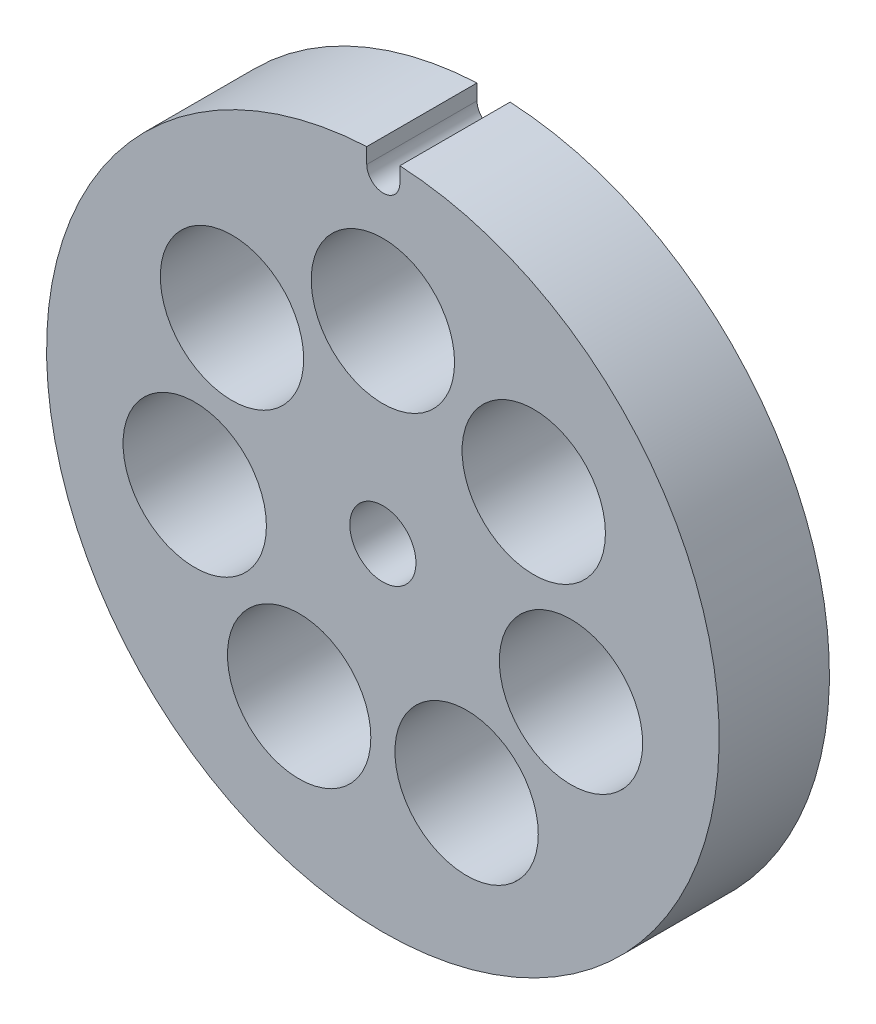
ISO-10303-21;
HEADER;
FILE_DESCRIPTION(('STEP AP214'),'2;1');
FILE_NAME('part.step','',(''),(''),'','','');
FILE_SCHEMA(('AUTOMOTIVE_DESIGN { 1 0 10303 214 1 1 1 1 }'));
ENDSEC;
DATA;
#1=APPLICATION_CONTEXT('core data for automotive mechanical design processes');
#2=APPLICATION_PROTOCOL_DEFINITION('international standard','automotive_design',2000,#1);
#3=PRODUCT_CONTEXT('',#1,'mechanical');
#4=PRODUCT('Part','Part','',(#3));
#5=PRODUCT_RELATED_PRODUCT_CATEGORY('part','',(#4));
#6=PRODUCT_DEFINITION_FORMATION('','',#4);
#7=PRODUCT_DEFINITION_CONTEXT('part definition',#1,'design');
#8=PRODUCT_DEFINITION('design','',#6,#7);
#9=PRODUCT_DEFINITION_SHAPE('','',#8);
#10=(LENGTH_UNIT() NAMED_UNIT(*) SI_UNIT(.MILLI.,.METRE.));
#11=(NAMED_UNIT(*) PLANE_ANGLE_UNIT() SI_UNIT($,.RADIAN.));
#12=(NAMED_UNIT(*) SI_UNIT($,.STERADIAN.) SOLID_ANGLE_UNIT());
#13=UNCERTAINTY_MEASURE_WITH_UNIT(LENGTH_MEASURE(1.E-05),#10,'distance_accuracy_value','');
#14=(GEOMETRIC_REPRESENTATION_CONTEXT(3) GLOBAL_UNCERTAINTY_ASSIGNED_CONTEXT((#13)) GLOBAL_UNIT_ASSIGNED_CONTEXT((#10,
#11,#12)) REPRESENTATION_CONTEXT('',''));
#15=CARTESIAN_POINT('',(0.,0.,0.));
#16=DIRECTION('',(0.,0.,1.));
#17=DIRECTION('',(1.,0.,0.));
#18=AXIS2_PLACEMENT_3D('',#15,#16,#17);
#19=CARTESIAN_POINT('',(0.0364619666380359,29.0612751641338,10.));
#20=DIRECTION('',(0.,0.,-1.));
#21=DIRECTION('',(-1.,0.,0.));
#22=AXIS2_PLACEMENT_3D('',#19,#20,#21);
#23=CYLINDRICAL_SURFACE('',#22,1.5);
#24=CARTESIAN_POINT('',(0.0364619666380359,29.0612751641338,0.));
#25=DIRECTION('',(0.,0.,1.));
#26=DIRECTION('',(1.,0.,0.));
#27=AXIS2_PLACEMENT_3D('',#24,#25,#26);
#28=CIRCLE('',#27,1.5);
#29=CARTESIAN_POINT('',(-1.46353803336196,29.0612751641338,0.));
#30=VERTEX_POINT('',#29);
#31=CARTESIAN_POINT('',(1.53646196663804,29.0612751641338,0.));
#32=VERTEX_POINT('',#31);
#33=EDGE_CURVE('E121',#30,#32,#28,.T.);
#34=ORIENTED_EDGE('',*,*,#33,.F.);
#35=DIRECTION('',(0.,0.,-1.));
#36=VECTOR('',#35,1.);
#37=CARTESIAN_POINT('',(-1.46353803336196,29.0612751641338,10.));
#38=LINE('',#37,#36);
#39=CARTESIAN_POINT('',(-1.46353803336196,29.0612751641338,10.));
#40=VERTEX_POINT('',#39);
#41=EDGE_CURVE('E11',#40,#30,#38,.T.);
#42=ORIENTED_EDGE('',*,*,#41,.F.);
#43=CARTESIAN_POINT('',(0.0364619666380359,29.0612751641338,10.));
#44=DIRECTION('',(0.,0.,1.));
#45=DIRECTION('',(1.,0.,0.));
#46=AXIS2_PLACEMENT_3D('',#43,#44,#45);
#47=CIRCLE('',#46,1.5);
#48=CARTESIAN_POINT('',(1.53646196663804,29.0612751641338,10.));
#49=VERTEX_POINT('',#48);
#50=EDGE_CURVE('E82',#40,#49,#47,.T.);
#51=ORIENTED_EDGE('',*,*,#50,.T.);
#52=DIRECTION('',(0.,0.,-1.));
#53=VECTOR('',#52,1.);
#54=CARTESIAN_POINT('',(1.53646196663804,29.0612751641338,10.));
#55=LINE('',#54,#53);
#56=EDGE_CURVE('E49',#49,#32,#55,.T.);
#57=ORIENTED_EDGE('',*,*,#56,.T.);
#58=EDGE_LOOP('',(#34,#42,#51,#57));
#59=FACE_BOUND('',#58,.T.);
#60=ADVANCED_FACE('F33',(#59),#23,.F.);
#61=CARTESIAN_POINT('',(-1.46353803336197,0.,10.));
#62=DIRECTION('',(-1.,0.,0.));
#63=DIRECTION('',(0.,-1.,0.));
#64=AXIS2_PLACEMENT_3D('',#61,#62,#63);
#65=PLANE('',#64);
#66=DIRECTION('',(0.,1.,0.));
#67=VECTOR('',#66,1.);
#68=CARTESIAN_POINT('',(-1.46353803336197,0.,0.));
#69=LINE('',#68,#67);
#70=CARTESIAN_POINT('',(-1.46353803336196,30.4648659347929,0.));
#71=VERTEX_POINT('',#70);
#72=EDGE_CURVE('E88',#30,#71,#69,.T.);
#73=ORIENTED_EDGE('',*,*,#72,.T.);
#74=DIRECTION('',(0.,0.,-1.));
#75=VECTOR('',#74,1.);
#76=CARTESIAN_POINT('',(-1.46353803336196,30.4648659347929,10.));
#77=LINE('',#76,#75);
#78=CARTESIAN_POINT('',(-1.46353803336196,30.4648659347929,10.));
#79=VERTEX_POINT('',#78);
#80=EDGE_CURVE('E41',#79,#71,#77,.T.);
#81=ORIENTED_EDGE('',*,*,#80,.F.);
#82=DIRECTION('',(0.,1.,0.));
#83=VECTOR('',#82,1.);
#84=CARTESIAN_POINT('',(-1.46353803336197,0.,10.));
#85=LINE('',#84,#83);
#86=EDGE_CURVE('E75',#40,#79,#85,.T.);
#87=ORIENTED_EDGE('',*,*,#86,.F.);
#88=ORIENTED_EDGE('',*,*,#41,.T.);
#89=EDGE_LOOP('',(#73,#81,#87,#88));
#90=FACE_BOUND('',#89,.T.);
#91=ADVANCED_FACE('F86',(#90),#65,.F.);
#92=CARTESIAN_POINT('',(0.,0.,10.));
#93=DIRECTION('',(0.,0.,-1.));
#94=DIRECTION('',(-1.,0.,0.));
#95=AXIS2_PLACEMENT_3D('',#92,#93,#94);
#96=CYLINDRICAL_SURFACE('',#95,30.5);
#97=CARTESIAN_POINT('',(0.,0.,0.));
#98=DIRECTION('',(0.,0.,1.));
#99=DIRECTION('',(1.,0.,0.));
#100=AXIS2_PLACEMENT_3D('',#97,#98,#99);
#101=CIRCLE('',#100,30.5);
#102=CARTESIAN_POINT('',(1.53646196663804,30.4612751641338,0.));
#103=VERTEX_POINT('',#102);
#104=EDGE_CURVE('E124',#71,#103,#101,.T.);
#105=ORIENTED_EDGE('',*,*,#104,.T.);
#106=DIRECTION('',(0.,0.,-1.));
#107=VECTOR('',#106,1.);
#108=CARTESIAN_POINT('',(1.53646196663804,30.4612751641338,10.));
#109=LINE('',#108,#107);
#110=CARTESIAN_POINT('',(1.53646196663804,30.4612751641338,10.));
#111=VERTEX_POINT('',#110);
#112=EDGE_CURVE('E63',#111,#103,#109,.T.);
#113=ORIENTED_EDGE('',*,*,#112,.F.);
#114=CARTESIAN_POINT('',(0.,0.,10.));
#115=DIRECTION('',(0.,0.,1.));
#116=DIRECTION('',(1.,0.,0.));
#117=AXIS2_PLACEMENT_3D('',#114,#115,#116);
#118=CIRCLE('',#117,30.5);
#119=EDGE_CURVE('E81',#79,#111,#118,.T.);
#120=ORIENTED_EDGE('',*,*,#119,.F.);
#121=ORIENTED_EDGE('',*,*,#80,.T.);
#122=EDGE_LOOP('',(#105,#113,#120,#121));
#123=FACE_BOUND('',#122,.T.);
#124=ADVANCED_FACE('F91',(#123),#96,.T.);
#125=CARTESIAN_POINT('',(0.,17.5,10.));
#126=DIRECTION('',(0.,0.,-1.));
#127=DIRECTION('',(-1.,0.,0.));
#128=AXIS2_PLACEMENT_3D('',#125,#126,#127);
#129=CYLINDRICAL_SURFACE('',#128,6.5);
#130=CARTESIAN_POINT('',(0.,17.5,10.));
#131=DIRECTION('',(0.,0.,1.));
#132=DIRECTION('',(1.,0.,0.));
#133=AXIS2_PLACEMENT_3D('',#130,#131,#132);
#134=CIRCLE('',#133,6.5);
#135=CARTESIAN_POINT('',(6.5,17.5,10.));
#136=VERTEX_POINT('',#135);
#137=EDGE_CURVE('E115',#136,#136,#134,.T.);
#138=ORIENTED_EDGE('',*,*,#137,.T.);
#139=EDGE_LOOP('',(#138));
#140=FACE_BOUND('',#139,.T.);
#141=CARTESIAN_POINT('',(0.,17.5,0.));
#142=DIRECTION('',(0.,0.,1.));
#143=DIRECTION('',(1.,0.,0.));
#144=AXIS2_PLACEMENT_3D('',#141,#142,#143);
#145=CIRCLE('',#144,6.5);
#146=CARTESIAN_POINT('',(6.5,17.5,0.));
#147=VERTEX_POINT('',#146);
#148=EDGE_CURVE('E147',#147,#147,#145,.T.);
#149=ORIENTED_EDGE('',*,*,#148,.F.);
#150=EDGE_LOOP('',(#149));
#151=FACE_BOUND('',#150,.T.);
#152=ADVANCED_FACE('F178',(#140,#151),#129,.F.);
#153=CARTESIAN_POINT('',(13.6820509431905,10.9110715325278,10.));
#154=DIRECTION('',(0.,0.,-1.));
#155=DIRECTION('',(-1.,0.,0.));
#156=AXIS2_PLACEMENT_3D('',#153,#154,#155);
#157=CYLINDRICAL_SURFACE('',#156,6.5);
#158=CARTESIAN_POINT('',(13.6820509431905,10.9110715325278,10.));
#159=DIRECTION('',(0.,0.,1.));
#160=DIRECTION('',(1.,0.,0.));
#161=AXIS2_PLACEMENT_3D('',#158,#159,#160);
#162=CIRCLE('',#161,6.5);
#163=CARTESIAN_POINT('',(20.1820509431905,10.9110715325278,10.));
#164=VERTEX_POINT('',#163);
#165=EDGE_CURVE('E112',#164,#164,#162,.T.);
#166=ORIENTED_EDGE('',*,*,#165,.T.);
#167=EDGE_LOOP('',(#166));
#168=FACE_BOUND('',#167,.T.);
#169=CARTESIAN_POINT('',(13.6820509431905,10.9110715325278,0.));
#170=DIRECTION('',(0.,0.,1.));
#171=DIRECTION('',(1.,0.,0.));
#172=AXIS2_PLACEMENT_3D('',#169,#170,#171);
#173=CIRCLE('',#172,6.5);
#174=CARTESIAN_POINT('',(20.1820509431905,10.9110715325278,0.));
#175=VERTEX_POINT('',#174);
#176=EDGE_CURVE('E144',#175,#175,#173,.T.);
#177=ORIENTED_EDGE('',*,*,#176,.F.);
#178=EDGE_LOOP('',(#177));
#179=FACE_BOUND('',#178,.T.);
#180=ADVANCED_FACE('F182',(#168,#179),#157,.F.);
#181=CARTESIAN_POINT('',(17.0612384631825,-3.89411634423502,10.));
#182=DIRECTION('',(0.,0.,-1.));
#183=DIRECTION('',(-1.,0.,0.));
#184=AXIS2_PLACEMENT_3D('',#181,#182,#183);
#185=CYLINDRICAL_SURFACE('',#184,6.5000000000005);
#186=CARTESIAN_POINT('',(17.0612384631825,-3.89411634423502,10.));
#187=DIRECTION('',(0.,0.,1.));
#188=DIRECTION('',(1.,0.,0.));
#189=AXIS2_PLACEMENT_3D('',#186,#187,#188);
#190=CIRCLE('',#189,6.5000000000005);
#191=CARTESIAN_POINT('',(23.561238463183,-3.89411634423502,10.));
#192=VERTEX_POINT('',#191);
#193=EDGE_CURVE('E109',#192,#192,#190,.T.);
#194=ORIENTED_EDGE('',*,*,#193,.T.);
#195=EDGE_LOOP('',(#194));
#196=FACE_BOUND('',#195,.T.);
#197=CARTESIAN_POINT('',(17.0612384631825,-3.89411634423502,0.));
#198=DIRECTION('',(0.,0.,1.));
#199=DIRECTION('',(1.,0.,0.));
#200=AXIS2_PLACEMENT_3D('',#197,#198,#199);
#201=CIRCLE('',#200,6.5000000000005);
#202=CARTESIAN_POINT('',(23.561238463183,-3.89411634423502,0.));
#203=VERTEX_POINT('',#202);
#204=EDGE_CURVE('E141',#203,#203,#201,.T.);
#205=ORIENTED_EDGE('',*,*,#204,.F.);
#206=EDGE_LOOP('',(#205));
#207=FACE_BOUND('',#206,.T.);
#208=ADVANCED_FACE('F188',(#196,#207),#185,.F.);
#209=CARTESIAN_POINT('',(7.59296543455821,-15.7669551882921,10.));
#210=DIRECTION('',(0.,0.,-1.));
#211=DIRECTION('',(-1.,0.,0.));
#212=AXIS2_PLACEMENT_3D('',#209,#210,#211);
#213=CYLINDRICAL_SURFACE('',#212,6.50000000000094);
#214=CARTESIAN_POINT('',(7.59296543455821,-15.7669551882921,10.));
#215=DIRECTION('',(0.,0.,1.));
#216=DIRECTION('',(1.,0.,0.));
#217=AXIS2_PLACEMENT_3D('',#214,#215,#216);
#218=CIRCLE('',#217,6.50000000000094);
#219=CARTESIAN_POINT('',(14.0929654345591,-15.7669551882921,10.));
#220=VERTEX_POINT('',#219);
#221=EDGE_CURVE('E106',#220,#220,#218,.T.);
#222=ORIENTED_EDGE('',*,*,#221,.T.);
#223=EDGE_LOOP('',(#222));
#224=FACE_BOUND('',#223,.T.);
#225=CARTESIAN_POINT('',(7.59296543455821,-15.7669551882921,0.));
#226=DIRECTION('',(0.,0.,1.));
#227=DIRECTION('',(1.,0.,0.));
#228=AXIS2_PLACEMENT_3D('',#225,#226,#227);
#229=CIRCLE('',#228,6.50000000000094);
#230=CARTESIAN_POINT('',(14.0929654345591,-15.7669551882921,0.));
#231=VERTEX_POINT('',#230);
#232=EDGE_CURVE('E138',#231,#231,#229,.T.);
#233=ORIENTED_EDGE('',*,*,#232,.F.);
#234=EDGE_LOOP('',(#233));
#235=FACE_BOUND('',#234,.T.);
#236=ADVANCED_FACE('F196',(#224,#235),#213,.F.);
#237=CARTESIAN_POINT('',(-7.59296543455633,-15.7669551882926,10.));
#238=DIRECTION('',(0.,0.,-1.));
#239=DIRECTION('',(-1.,0.,0.));
#240=AXIS2_PLACEMENT_3D('',#237,#238,#239);
#241=CYLINDRICAL_SURFACE('',#240,6.50000000000109);
#242=CARTESIAN_POINT('',(-7.59296543455633,-15.7669551882926,10.));
#243=DIRECTION('',(0.,0.,1.));
#244=DIRECTION('',(1.,0.,0.));
#245=AXIS2_PLACEMENT_3D('',#242,#243,#244);
#246=CIRCLE('',#245,6.50000000000109);
#247=CARTESIAN_POINT('',(-1.09296543455523,-15.7669551882926,10.));
#248=VERTEX_POINT('',#247);
#249=EDGE_CURVE('E103',#248,#248,#246,.T.);
#250=ORIENTED_EDGE('',*,*,#249,.T.);
#251=EDGE_LOOP('',(#250));
#252=FACE_BOUND('',#251,.T.);
#253=CARTESIAN_POINT('',(-7.59296543455633,-15.7669551882926,0.));
#254=DIRECTION('',(0.,0.,1.));
#255=DIRECTION('',(1.,0.,0.));
#256=AXIS2_PLACEMENT_3D('',#253,#254,#255);
#257=CIRCLE('',#256,6.50000000000109);
#258=CARTESIAN_POINT('',(-1.09296543455523,-15.7669551882926,0.));
#259=VERTEX_POINT('',#258);
#260=EDGE_CURVE('E135',#259,#259,#257,.T.);
#261=ORIENTED_EDGE('',*,*,#260,.F.);
#262=EDGE_LOOP('',(#261));
#263=FACE_BOUND('',#262,.T.);
#264=ADVANCED_FACE('F200',(#252,#263),#241,.F.);
#265=CARTESIAN_POINT('',(-17.0612384631813,-3.89411634423599,10.));
#266=DIRECTION('',(0.,0.,-1.));
#267=DIRECTION('',(-1.,0.,0.));
#268=AXIS2_PLACEMENT_3D('',#265,#266,#267);
#269=CYLINDRICAL_SURFACE('',#268,6.50000000000088);
#270=CARTESIAN_POINT('',(-17.0612384631813,-3.89411634423599,10.));
#271=DIRECTION('',(0.,0.,1.));
#272=DIRECTION('',(1.,0.,0.));
#273=AXIS2_PLACEMENT_3D('',#270,#271,#272);
#274=CIRCLE('',#273,6.50000000000088);
#275=CARTESIAN_POINT('',(-10.5612384631804,-3.89411634423599,10.));
#276=VERTEX_POINT('',#275);
#277=EDGE_CURVE('E100',#276,#276,#274,.T.);
#278=ORIENTED_EDGE('',*,*,#277,.T.);
#279=EDGE_LOOP('',(#278));
#280=FACE_BOUND('',#279,.T.);
#281=CARTESIAN_POINT('',(-17.0612384631813,-3.89411634423599,0.));
#282=DIRECTION('',(0.,0.,1.));
#283=DIRECTION('',(1.,0.,0.));
#284=AXIS2_PLACEMENT_3D('',#281,#282,#283);
#285=CIRCLE('',#284,6.50000000000088);
#286=CARTESIAN_POINT('',(-10.5612384631804,-3.89411634423599,0.));
#287=VERTEX_POINT('',#286);
#288=EDGE_CURVE('E132',#287,#287,#285,.T.);
#289=ORIENTED_EDGE('',*,*,#288,.F.);
#290=EDGE_LOOP('',(#289));
#291=FACE_BOUND('',#290,.T.);
#292=ADVANCED_FACE('F167',(#280,#291),#269,.F.);
#293=CARTESIAN_POINT('',(-13.6820509431904,10.911071532528,10.));
#294=DIRECTION('',(0.,0.,-1.));
#295=DIRECTION('',(-1.,0.,0.));
#296=AXIS2_PLACEMENT_3D('',#293,#294,#295);
#297=CYLINDRICAL_SURFACE('',#296,6.5);
#298=CARTESIAN_POINT('',(-13.6820509431904,10.911071532528,10.));
#299=DIRECTION('',(0.,0.,1.));
#300=DIRECTION('',(1.,0.,0.));
#301=AXIS2_PLACEMENT_3D('',#298,#299,#300);
#302=CIRCLE('',#301,6.5);
#303=CARTESIAN_POINT('',(-7.18205094319039,10.911071532528,10.));
#304=VERTEX_POINT('',#303);
#305=EDGE_CURVE('E94',#304,#304,#302,.T.);
#306=ORIENTED_EDGE('',*,*,#305,.T.);
#307=EDGE_LOOP('',(#306));
#308=FACE_BOUND('',#307,.T.);
#309=CARTESIAN_POINT('',(-13.6820509431904,10.911071532528,0.));
#310=DIRECTION('',(0.,0.,1.));
#311=DIRECTION('',(1.,0.,0.));
#312=AXIS2_PLACEMENT_3D('',#309,#310,#311);
#313=CIRCLE('',#312,6.5);
#314=CARTESIAN_POINT('',(-7.18205094319039,10.911071532528,0.));
#315=VERTEX_POINT('',#314);
#316=EDGE_CURVE('E129',#315,#315,#313,.T.);
#317=ORIENTED_EDGE('',*,*,#316,.F.);
#318=EDGE_LOOP('',(#317));
#319=FACE_BOUND('',#318,.T.);
#320=ADVANCED_FACE('F159',(#308,#319),#297,.F.);
#321=CARTESIAN_POINT('',(1.53646196663803,0.,10.));
#322=DIRECTION('',(-1.,0.,0.));
#323=DIRECTION('',(0.,-1.,0.));
#324=AXIS2_PLACEMENT_3D('',#321,#322,#323);
#325=PLANE('',#324);
#326=DIRECTION('',(0.,1.,0.));
#327=VECTOR('',#326,1.);
#328=CARTESIAN_POINT('',(1.53646196663803,0.,0.));
#329=LINE('',#328,#327);
#330=EDGE_CURVE('E126',#32,#103,#329,.T.);
#331=ORIENTED_EDGE('',*,*,#330,.F.);
#332=ORIENTED_EDGE('',*,*,#56,.F.);
#333=DIRECTION('',(0.,1.,0.));
#334=VECTOR('',#333,1.);
#335=CARTESIAN_POINT('',(1.53646196663803,0.,10.));
#336=LINE('',#335,#334);
#337=EDGE_CURVE('E92',#49,#111,#336,.T.);
#338=ORIENTED_EDGE('',*,*,#337,.T.);
#339=ORIENTED_EDGE('',*,*,#112,.T.);
#340=EDGE_LOOP('',(#331,#332,#338,#339));
#341=FACE_BOUND('',#340,.T.);
#342=ADVANCED_FACE('F156',(#341),#325,.T.);
#343=CARTESIAN_POINT('',(0.,0.,10.));
#344=DIRECTION('',(0.,0.,-1.));
#345=DIRECTION('',(-1.,0.,0.));
#346=AXIS2_PLACEMENT_3D('',#343,#344,#345);
#347=CYLINDRICAL_SURFACE('',#346,3.);
#348=CARTESIAN_POINT('',(0.,0.,10.));
#349=DIRECTION('',(0.,0.,1.));
#350=DIRECTION('',(1.,0.,0.));
#351=AXIS2_PLACEMENT_3D('',#348,#349,#350);
#352=CIRCLE('',#351,3.);
#353=CARTESIAN_POINT('',(3.,0.,10.));
#354=VERTEX_POINT('',#353);
#355=EDGE_CURVE('E118',#354,#354,#352,.T.);
#356=ORIENTED_EDGE('',*,*,#355,.T.);
#357=EDGE_LOOP('',(#356));
#358=FACE_BOUND('',#357,.T.);
#359=CARTESIAN_POINT('',(0.,0.,0.));
#360=DIRECTION('',(0.,0.,1.));
#361=DIRECTION('',(1.,0.,0.));
#362=AXIS2_PLACEMENT_3D('',#359,#360,#361);
#363=CIRCLE('',#362,3.);
#364=CARTESIAN_POINT('',(3.,0.,0.));
#365=VERTEX_POINT('',#364);
#366=EDGE_CURVE('E150',#365,#365,#363,.T.);
#367=ORIENTED_EDGE('',*,*,#366,.F.);
#368=EDGE_LOOP('',(#367));
#369=FACE_BOUND('',#368,.T.);
#370=ADVANCED_FACE('F158',(#358,#369),#347,.F.);
#371=CARTESIAN_POINT('',(0.,0.,10.));
#372=DIRECTION('',(0.,0.,1.));
#373=DIRECTION('',(1.,0.,0.));
#374=AXIS2_PLACEMENT_3D('',#371,#372,#373);
#375=PLANE('',#374);
#376=ORIENTED_EDGE('',*,*,#50,.F.);
#377=ORIENTED_EDGE('',*,*,#86,.T.);
#378=ORIENTED_EDGE('',*,*,#119,.T.);
#379=ORIENTED_EDGE('',*,*,#337,.F.);
#380=EDGE_LOOP('',(#376,#377,#378,#379));
#381=FACE_BOUND('',#380,.T.);
#382=ORIENTED_EDGE('',*,*,#305,.F.);
#383=EDGE_LOOP('',(#382));
#384=FACE_BOUND('',#383,.T.);
#385=ORIENTED_EDGE('',*,*,#277,.F.);
#386=EDGE_LOOP('',(#385));
#387=FACE_BOUND('',#386,.T.);
#388=ORIENTED_EDGE('',*,*,#249,.F.);
#389=EDGE_LOOP('',(#388));
#390=FACE_BOUND('',#389,.T.);
#391=ORIENTED_EDGE('',*,*,#221,.F.);
#392=EDGE_LOOP('',(#391));
#393=FACE_BOUND('',#392,.T.);
#394=ORIENTED_EDGE('',*,*,#193,.F.);
#395=EDGE_LOOP('',(#394));
#396=FACE_BOUND('',#395,.T.);
#397=ORIENTED_EDGE('',*,*,#165,.F.);
#398=EDGE_LOOP('',(#397));
#399=FACE_BOUND('',#398,.T.);
#400=ORIENTED_EDGE('',*,*,#137,.F.);
#401=EDGE_LOOP('',(#400));
#402=FACE_BOUND('',#401,.T.);
#403=ORIENTED_EDGE('',*,*,#355,.F.);
#404=EDGE_LOOP('',(#403));
#405=FACE_BOUND('',#404,.T.);
#406=ADVANCED_FACE('F77',(#381,#384,#387,#390,#393,#396,#399,#402,#405),#375,.T.);
#407=CARTESIAN_POINT('',(0.,0.,0.));
#408=DIRECTION('',(0.,0.,1.));
#409=DIRECTION('',(1.,0.,0.));
#410=AXIS2_PLACEMENT_3D('',#407,#408,#409);
#411=PLANE('',#410);
#412=ORIENTED_EDGE('',*,*,#33,.T.);
#413=ORIENTED_EDGE('',*,*,#330,.T.);
#414=ORIENTED_EDGE('',*,*,#104,.F.);
#415=ORIENTED_EDGE('',*,*,#72,.F.);
#416=EDGE_LOOP('',(#412,#413,#414,#415));
#417=FACE_BOUND('',#416,.T.);
#418=ORIENTED_EDGE('',*,*,#316,.T.);
#419=EDGE_LOOP('',(#418));
#420=FACE_BOUND('',#419,.T.);
#421=ORIENTED_EDGE('',*,*,#288,.T.);
#422=EDGE_LOOP('',(#421));
#423=FACE_BOUND('',#422,.T.);
#424=ORIENTED_EDGE('',*,*,#260,.T.);
#425=EDGE_LOOP('',(#424));
#426=FACE_BOUND('',#425,.T.);
#427=ORIENTED_EDGE('',*,*,#232,.T.);
#428=EDGE_LOOP('',(#427));
#429=FACE_BOUND('',#428,.T.);
#430=ORIENTED_EDGE('',*,*,#204,.T.);
#431=EDGE_LOOP('',(#430));
#432=FACE_BOUND('',#431,.T.);
#433=ORIENTED_EDGE('',*,*,#176,.T.);
#434=EDGE_LOOP('',(#433));
#435=FACE_BOUND('',#434,.T.);
#436=ORIENTED_EDGE('',*,*,#148,.T.);
#437=EDGE_LOOP('',(#436));
#438=FACE_BOUND('',#437,.T.);
#439=ORIENTED_EDGE('',*,*,#366,.T.);
#440=EDGE_LOOP('',(#439));
#441=FACE_BOUND('',#440,.T.);
#442=ADVANCED_FACE('F213',(#417,#420,#423,#426,#429,#432,#435,#438,#441),#411,.F.);
#443=CLOSED_SHELL('',(#60,#91,#124,#152,#180,#208,#236,#264,#292,#320,#342,#370,#406,#442));
#444=MANIFOLD_SOLID_BREP('B2',#443);
#445=ADVANCED_BREP_SHAPE_REPRESENTATION('',(#18,#444),#14);
#446=SHAPE_DEFINITION_REPRESENTATION(#9,#445);
ENDSEC;
END-ISO-10303-21;
